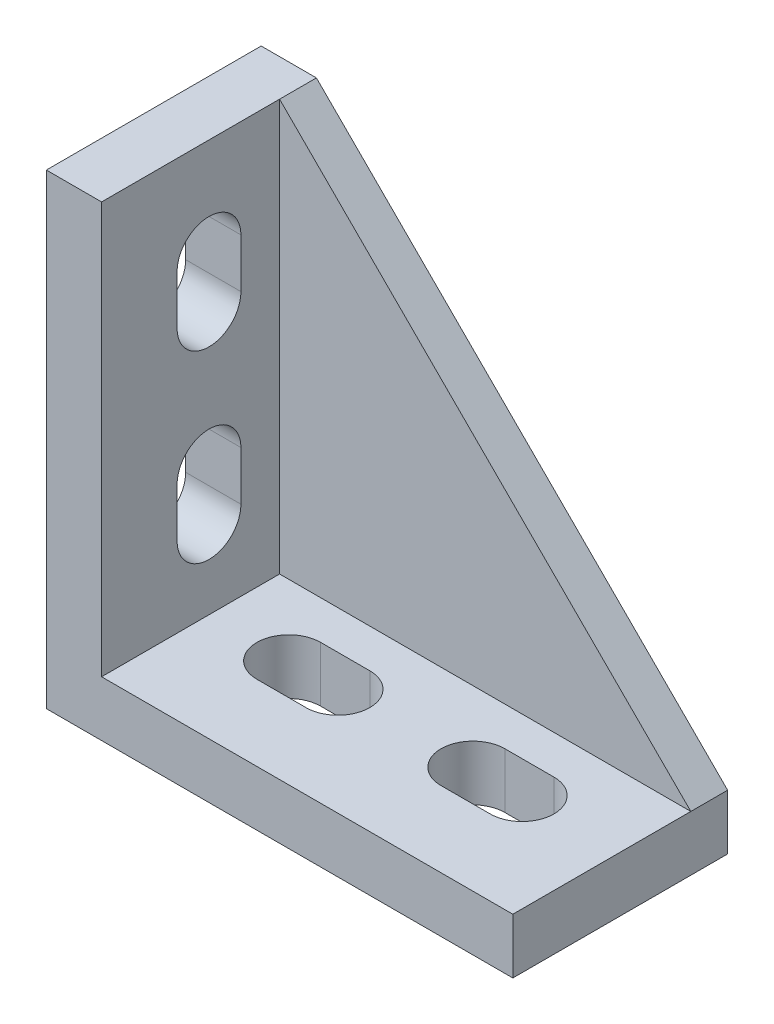
ISO-10303-21;
HEADER;
FILE_DESCRIPTION(('STEP AP214'),'2;1');
FILE_NAME('part.step','',(''),(''),'','','');
FILE_SCHEMA(('AUTOMOTIVE_DESIGN { 1 0 10303 214 1 1 1 1 }'));
ENDSEC;
DATA;
#1=APPLICATION_CONTEXT('core data for automotive mechanical design processes');
#2=APPLICATION_PROTOCOL_DEFINITION('international standard','automotive_design',2000,#1);
#3=PRODUCT_CONTEXT('',#1,'mechanical');
#4=PRODUCT('Part','Part','',(#3));
#5=PRODUCT_RELATED_PRODUCT_CATEGORY('part','',(#4));
#6=PRODUCT_DEFINITION_FORMATION('','',#4);
#7=PRODUCT_DEFINITION_CONTEXT('part definition',#1,'design');
#8=PRODUCT_DEFINITION('design','',#6,#7);
#9=PRODUCT_DEFINITION_SHAPE('','',#8);
#10=(LENGTH_UNIT() NAMED_UNIT(*) SI_UNIT(.MILLI.,.METRE.));
#11=(NAMED_UNIT(*) PLANE_ANGLE_UNIT() SI_UNIT($,.RADIAN.));
#12=(NAMED_UNIT(*) SI_UNIT($,.STERADIAN.) SOLID_ANGLE_UNIT());
#13=UNCERTAINTY_MEASURE_WITH_UNIT(LENGTH_MEASURE(1.E-05),#10,'distance_accuracy_value','');
#14=(GEOMETRIC_REPRESENTATION_CONTEXT(3) GLOBAL_UNCERTAINTY_ASSIGNED_CONTEXT((#13)) GLOBAL_UNIT_ASSIGNED_CONTEXT((#10,
#11,#12)) REPRESENTATION_CONTEXT('',''));
#15=CARTESIAN_POINT('',(0.,0.,0.));
#16=DIRECTION('',(0.,0.,1.));
#17=DIRECTION('',(1.,0.,0.));
#18=AXIS2_PLACEMENT_3D('',#15,#16,#17);
#19=CARTESIAN_POINT('',(4.5000000000001,4.5,8.75));
#20=DIRECTION('',(0.,1.,0.));
#21=DIRECTION('',(-1.,0.,0.));
#22=AXIS2_PLACEMENT_3D('',#19,#20,#21);
#23=PLANE('',#22);
#24=CARTESIAN_POINT('',(30.,4.49999999999991,0.));
#25=DIRECTION('',(0.,1.,0.));
#26=DIRECTION('',(-1.,0.,0.));
#27=AXIS2_PLACEMENT_3D('',#24,#25,#26);
#28=CIRCLE('',#27,2.6);
#29=CARTESIAN_POINT('',(30.,4.49999999999991,2.6));
#30=VERTEX_POINT('',#29);
#31=CARTESIAN_POINT('',(30.,4.49999999999991,-2.6));
#32=VERTEX_POINT('',#31);
#33=EDGE_CURVE('E272',#30,#32,#28,.T.);
#34=ORIENTED_EDGE('',*,*,#33,.F.);
#35=DIRECTION('',(1.,0.,0.));
#36=VECTOR('',#35,1.);
#37=CARTESIAN_POINT('',(30.,4.49999999999991,2.6));
#38=LINE('',#37,#36);
#39=CARTESIAN_POINT('',(26.,4.49999999999993,2.6));
#40=VERTEX_POINT('',#39);
#41=EDGE_CURVE('E262',#40,#30,#38,.T.);
#42=ORIENTED_EDGE('',*,*,#41,.F.);
#43=CARTESIAN_POINT('',(26.,4.49999999999993,0.));
#44=DIRECTION('',(0.,1.,0.));
#45=DIRECTION('',(-1.,0.,0.));
#46=AXIS2_PLACEMENT_3D('',#43,#44,#45);
#47=CIRCLE('',#46,2.6);
#48=CARTESIAN_POINT('',(26.,4.49999999999993,-2.6));
#49=VERTEX_POINT('',#48);
#50=EDGE_CURVE('E278',#49,#40,#47,.T.);
#51=ORIENTED_EDGE('',*,*,#50,.F.);
#52=DIRECTION('',(-1.,0.,0.));
#53=VECTOR('',#52,1.);
#54=CARTESIAN_POINT('',(30.,4.49999999999991,-2.6));
#55=LINE('',#54,#53);
#56=EDGE_CURVE('E274',#32,#49,#55,.T.);
#57=ORIENTED_EDGE('',*,*,#56,.F.);
#58=EDGE_LOOP('',(#34,#42,#51,#57));
#59=FACE_BOUND('',#58,.T.);
#60=CARTESIAN_POINT('',(11.,4.49999999999998,0.));
#61=DIRECTION('',(0.,1.,0.));
#62=DIRECTION('',(-1.,0.,0.));
#63=AXIS2_PLACEMENT_3D('',#60,#61,#62);
#64=CIRCLE('',#63,2.6);
#65=CARTESIAN_POINT('',(11.,4.49999999999998,-2.6));
#66=VERTEX_POINT('',#65);
#67=CARTESIAN_POINT('',(11.,4.49999999999998,2.6));
#68=VERTEX_POINT('',#67);
#69=EDGE_CURVE('E225',#66,#68,#64,.T.);
#70=ORIENTED_EDGE('',*,*,#69,.F.);
#71=DIRECTION('',(-1.,0.,0.));
#72=VECTOR('',#71,1.);
#73=CARTESIAN_POINT('',(11.,4.49999999999998,-2.6));
#74=LINE('',#73,#72);
#75=CARTESIAN_POINT('',(15.,4.49999999999997,-2.6));
#76=VERTEX_POINT('',#75);
#77=EDGE_CURVE('E296',#76,#66,#74,.T.);
#78=ORIENTED_EDGE('',*,*,#77,.F.);
#79=CARTESIAN_POINT('',(15.,4.49999999999997,0.));
#80=DIRECTION('',(0.,1.,0.));
#81=DIRECTION('',(-1.,0.,0.));
#82=AXIS2_PLACEMENT_3D('',#79,#80,#81);
#83=CIRCLE('',#82,2.6);
#84=CARTESIAN_POINT('',(15.,4.49999999999997,2.6));
#85=VERTEX_POINT('',#84);
#86=EDGE_CURVE('E310',#85,#76,#83,.T.);
#87=ORIENTED_EDGE('',*,*,#86,.F.);
#88=DIRECTION('',(1.,0.,0.));
#89=VECTOR('',#88,1.);
#90=CARTESIAN_POINT('',(11.,4.49999999999998,2.6));
#91=LINE('',#90,#89);
#92=EDGE_CURVE('E307',#68,#85,#91,.T.);
#93=ORIENTED_EDGE('',*,*,#92,.F.);
#94=EDGE_LOOP('',(#70,#78,#87,#93));
#95=FACE_BOUND('',#94,.T.);
#96=DIRECTION('',(0.,0.,-1.));
#97=VECTOR('',#96,1.);
#98=CARTESIAN_POINT('',(38.,4.49999999999989,8.75));
#99=LINE('',#98,#97);
#100=CARTESIAN_POINT('',(38.,4.49999999999989,8.75));
#101=VERTEX_POINT('',#100);
#102=CARTESIAN_POINT('',(38.,4.49999999999989,-5.75));
#103=VERTEX_POINT('',#102);
#104=EDGE_CURVE('E371',#101,#103,#99,.T.);
#105=ORIENTED_EDGE('',*,*,#104,.T.);
#106=DIRECTION('',(-1.,0.,0.));
#107=VECTOR('',#106,1.);
#108=CARTESIAN_POINT('',(4.5000000000001,4.5,-5.75));
#109=LINE('',#108,#107);
#110=CARTESIAN_POINT('',(4.5000000000001,4.5,-5.75));
#111=VERTEX_POINT('',#110);
#112=EDGE_CURVE('E330',#103,#111,#109,.T.);
#113=ORIENTED_EDGE('',*,*,#112,.T.);
#114=DIRECTION('',(0.,0.,-1.));
#115=VECTOR('',#114,1.);
#116=CARTESIAN_POINT('',(4.5000000000001,4.5,8.75));
#117=LINE('',#116,#115);
#118=CARTESIAN_POINT('',(4.5000000000001,4.5,8.75));
#119=VERTEX_POINT('',#118);
#120=EDGE_CURVE('E374',#119,#111,#117,.T.);
#121=ORIENTED_EDGE('',*,*,#120,.F.);
#122=DIRECTION('',(1.,0.,0.));
#123=VECTOR('',#122,1.);
#124=CARTESIAN_POINT('',(4.5000000000001,4.5,8.75));
#125=LINE('',#124,#123);
#126=EDGE_CURVE('E343',#119,#101,#125,.T.);
#127=ORIENTED_EDGE('',*,*,#126,.T.);
#128=EDGE_LOOP('',(#105,#113,#121,#127));
#129=FACE_BOUND('',#128,.T.);
#130=ADVANCED_FACE('F33',(#59,#95,#129),#23,.T.);
#131=CARTESIAN_POINT('',(4.5,38.,8.75));
#132=DIRECTION('',(1.,0.,0.));
#133=DIRECTION('',(0.,1.,0.));
#134=AXIS2_PLACEMENT_3D('',#131,#132,#133);
#135=PLANE('',#134);
#136=CARTESIAN_POINT('',(4.50000000000002,30.,0.));
#137=DIRECTION('',(1.,0.,0.));
#138=DIRECTION('',(0.,1.,0.));
#139=AXIS2_PLACEMENT_3D('',#136,#137,#138);
#140=CIRCLE('',#139,2.6);
#141=CARTESIAN_POINT('',(4.50000000000002,30.,-2.6));
#142=VERTEX_POINT('',#141);
#143=CARTESIAN_POINT('',(4.50000000000002,30.,2.6));
#144=VERTEX_POINT('',#143);
#145=EDGE_CURVE('E48',#142,#144,#140,.T.);
#146=ORIENTED_EDGE('',*,*,#145,.F.);
#147=DIRECTION('',(0.,1.,0.));
#148=VECTOR('',#147,1.);
#149=CARTESIAN_POINT('',(4.50000000000002,30.,-2.6));
#150=LINE('',#149,#148);
#151=CARTESIAN_POINT('',(4.50000000000004,26.,-2.6));
#152=VERTEX_POINT('',#151);
#153=EDGE_CURVE('E209',#152,#142,#150,.T.);
#154=ORIENTED_EDGE('',*,*,#153,.F.);
#155=CARTESIAN_POINT('',(4.50000000000004,26.,0.));
#156=DIRECTION('',(1.,0.,0.));
#157=DIRECTION('',(0.,1.,0.));
#158=AXIS2_PLACEMENT_3D('',#155,#156,#157);
#159=CIRCLE('',#158,2.6);
#160=CARTESIAN_POINT('',(4.50000000000004,26.,2.6));
#161=VERTEX_POINT('',#160);
#162=EDGE_CURVE('E212',#161,#152,#159,.T.);
#163=ORIENTED_EDGE('',*,*,#162,.F.);
#164=DIRECTION('',(0.,-1.,0.));
#165=VECTOR('',#164,1.);
#166=CARTESIAN_POINT('',(4.50000000000002,30.,2.6));
#167=LINE('',#166,#165);
#168=EDGE_CURVE('E218',#144,#161,#167,.T.);
#169=ORIENTED_EDGE('',*,*,#168,.F.);
#170=EDGE_LOOP('',(#146,#154,#163,#169));
#171=FACE_BOUND('',#170,.T.);
#172=CARTESIAN_POINT('',(4.50000000000007,15.,0.));
#173=DIRECTION('',(1.,0.,0.));
#174=DIRECTION('',(0.,1.,0.));
#175=AXIS2_PLACEMENT_3D('',#172,#173,#174);
#176=CIRCLE('',#175,2.6);
#177=CARTESIAN_POINT('',(4.50000000000007,15.,-2.6));
#178=VERTEX_POINT('',#177);
#179=CARTESIAN_POINT('',(4.50000000000007,15.,2.6));
#180=VERTEX_POINT('',#179);
#181=EDGE_CURVE('E56',#178,#180,#176,.T.);
#182=ORIENTED_EDGE('',*,*,#181,.F.);
#183=DIRECTION('',(0.,1.,0.));
#184=VECTOR('',#183,1.);
#185=CARTESIAN_POINT('',(4.50000000000007,15.,-2.6));
#186=LINE('',#185,#184);
#187=CARTESIAN_POINT('',(4.50000000000008,11.,-2.6));
#188=VERTEX_POINT('',#187);
#189=EDGE_CURVE('E233',#188,#178,#186,.T.);
#190=ORIENTED_EDGE('',*,*,#189,.F.);
#191=CARTESIAN_POINT('',(4.50000000000008,11.,0.));
#192=DIRECTION('',(1.,0.,0.));
#193=DIRECTION('',(0.,1.,0.));
#194=AXIS2_PLACEMENT_3D('',#191,#192,#193);
#195=CIRCLE('',#194,2.6);
#196=CARTESIAN_POINT('',(4.50000000000008,11.,2.6));
#197=VERTEX_POINT('',#196);
#198=EDGE_CURVE('E247',#197,#188,#195,.T.);
#199=ORIENTED_EDGE('',*,*,#198,.F.);
#200=DIRECTION('',(0.,-1.,0.));
#201=VECTOR('',#200,1.);
#202=CARTESIAN_POINT('',(4.50000000000007,15.,2.6));
#203=LINE('',#202,#201);
#204=EDGE_CURVE('E244',#180,#197,#203,.T.);
#205=ORIENTED_EDGE('',*,*,#204,.F.);
#206=EDGE_LOOP('',(#182,#190,#199,#205));
#207=FACE_BOUND('',#206,.T.);
#208=ORIENTED_EDGE('',*,*,#120,.T.);
#209=DIRECTION('',(0.,1.,0.));
#210=VECTOR('',#209,1.);
#211=CARTESIAN_POINT('',(4.5,38.,-5.75));
#212=LINE('',#211,#210);
#213=CARTESIAN_POINT('',(4.5,38.,-5.75));
#214=VERTEX_POINT('',#213);
#215=EDGE_CURVE('E11',#111,#214,#212,.T.);
#216=ORIENTED_EDGE('',*,*,#215,.T.);
#217=DIRECTION('',(0.,0.,-1.));
#218=VECTOR('',#217,1.);
#219=CARTESIAN_POINT('',(4.5,38.,8.75));
#220=LINE('',#219,#218);
#221=CARTESIAN_POINT('',(4.5,38.,8.75));
#222=VERTEX_POINT('',#221);
#223=EDGE_CURVE('E355',#222,#214,#220,.T.);
#224=ORIENTED_EDGE('',*,*,#223,.F.);
#225=DIRECTION('',(0.,-1.,0.));
#226=VECTOR('',#225,1.);
#227=CARTESIAN_POINT('',(4.5,38.,8.75));
#228=LINE('',#227,#226);
#229=EDGE_CURVE('E339',#222,#119,#228,.T.);
#230=ORIENTED_EDGE('',*,*,#229,.T.);
#231=EDGE_LOOP('',(#208,#216,#224,#230));
#232=FACE_BOUND('',#231,.T.);
#233=ADVANCED_FACE('F382',(#171,#207,#232),#135,.T.);
#234=CARTESIAN_POINT('',(0.,38.,8.75));
#235=DIRECTION('',(0.,1.,0.));
#236=DIRECTION('',(0.,0.,1.));
#237=AXIS2_PLACEMENT_3D('',#234,#235,#236);
#238=PLANE('',#237);
#239=DIRECTION('',(1.,0.,0.));
#240=VECTOR('',#239,1.);
#241=CARTESIAN_POINT('',(0.,38.,-8.75));
#242=LINE('',#241,#240);
#243=CARTESIAN_POINT('',(0.,38.,-8.75));
#244=VERTEX_POINT('',#243);
#245=CARTESIAN_POINT('',(4.5,38.,-8.75));
#246=VERTEX_POINT('',#245);
#247=EDGE_CURVE('E335',#244,#246,#242,.T.);
#248=ORIENTED_EDGE('',*,*,#247,.F.);
#249=DIRECTION('',(0.,0.,-1.));
#250=VECTOR('',#249,1.);
#251=CARTESIAN_POINT('',(0.,38.,8.75));
#252=LINE('',#251,#250);
#253=CARTESIAN_POINT('',(0.,38.,8.75));
#254=VERTEX_POINT('',#253);
#255=EDGE_CURVE('E41',#254,#244,#252,.T.);
#256=ORIENTED_EDGE('',*,*,#255,.F.);
#257=DIRECTION('',(1.,0.,0.));
#258=VECTOR('',#257,1.);
#259=CARTESIAN_POINT('',(0.,38.,8.75));
#260=LINE('',#259,#258);
#261=EDGE_CURVE('E336',#254,#222,#260,.T.);
#262=ORIENTED_EDGE('',*,*,#261,.T.);
#263=ORIENTED_EDGE('',*,*,#223,.T.);
#264=DIRECTION('',(0.,0.,-1.));
#265=VECTOR('',#264,1.);
#266=CARTESIAN_POINT('',(4.5,38.,-5.75));
#267=LINE('',#266,#265);
#268=EDGE_CURVE('E325',#214,#246,#267,.T.);
#269=ORIENTED_EDGE('',*,*,#268,.T.);
#270=EDGE_LOOP('',(#248,#256,#262,#263,#269));
#271=FACE_BOUND('',#270,.T.);
#272=ADVANCED_FACE('F35',(#271),#238,.T.);
#273=CARTESIAN_POINT('',(0.,0.,8.75));
#274=DIRECTION('',(-1.,0.,0.));
#275=DIRECTION('',(0.,0.,1.));
#276=AXIS2_PLACEMENT_3D('',#273,#274,#275);
#277=PLANE('',#276);
#278=CARTESIAN_POINT('',(0.,30.,0.));
#279=DIRECTION('',(1.,0.,0.));
#280=DIRECTION('',(0.,1.,0.));
#281=AXIS2_PLACEMENT_3D('',#278,#279,#280);
#282=CIRCLE('',#281,2.6);
#283=CARTESIAN_POINT('',(0.,30.,-2.6));
#284=VERTEX_POINT('',#283);
#285=CARTESIAN_POINT('',(0.,30.,2.6));
#286=VERTEX_POINT('',#285);
#287=EDGE_CURVE('E190',#284,#286,#282,.T.);
#288=ORIENTED_EDGE('',*,*,#287,.T.);
#289=DIRECTION('',(0.,-1.,0.));
#290=VECTOR('',#289,1.);
#291=CARTESIAN_POINT('',(0.,30.,2.6));
#292=LINE('',#291,#290);
#293=CARTESIAN_POINT('',(0.,26.,2.6));
#294=VERTEX_POINT('',#293);
#295=EDGE_CURVE('E200',#286,#294,#292,.T.);
#296=ORIENTED_EDGE('',*,*,#295,.T.);
#297=CARTESIAN_POINT('',(0.,26.,0.));
#298=DIRECTION('',(1.,0.,0.));
#299=DIRECTION('',(0.,1.,0.));
#300=AXIS2_PLACEMENT_3D('',#297,#298,#299);
#301=CIRCLE('',#300,2.6);
#302=CARTESIAN_POINT('',(0.,26.,-2.6));
#303=VERTEX_POINT('',#302);
#304=EDGE_CURVE('E204',#294,#303,#301,.T.);
#305=ORIENTED_EDGE('',*,*,#304,.T.);
#306=DIRECTION('',(0.,1.,0.));
#307=VECTOR('',#306,1.);
#308=CARTESIAN_POINT('',(0.,30.,-2.6));
#309=LINE('',#308,#307);
#310=EDGE_CURVE('E196',#303,#284,#309,.T.);
#311=ORIENTED_EDGE('',*,*,#310,.T.);
#312=EDGE_LOOP('',(#288,#296,#305,#311));
#313=FACE_BOUND('',#312,.T.);
#314=CARTESIAN_POINT('',(0.,15.,0.));
#315=DIRECTION('',(1.,0.,0.));
#316=DIRECTION('',(0.,1.,0.));
#317=AXIS2_PLACEMENT_3D('',#314,#315,#316);
#318=CIRCLE('',#317,2.6);
#319=CARTESIAN_POINT('',(0.,15.,-2.6));
#320=VERTEX_POINT('',#319);
#321=CARTESIAN_POINT('',(0.,15.,2.6));
#322=VERTEX_POINT('',#321);
#323=EDGE_CURVE('E229',#320,#322,#318,.T.);
#324=ORIENTED_EDGE('',*,*,#323,.T.);
#325=DIRECTION('',(0.,-1.,0.));
#326=VECTOR('',#325,1.);
#327=CARTESIAN_POINT('',(0.,15.,2.6));
#328=LINE('',#327,#326);
#329=CARTESIAN_POINT('',(0.,11.,2.6));
#330=VERTEX_POINT('',#329);
#331=EDGE_CURVE('E232',#322,#330,#328,.T.);
#332=ORIENTED_EDGE('',*,*,#331,.T.);
#333=CARTESIAN_POINT('',(0.,11.,0.));
#334=DIRECTION('',(1.,0.,0.));
#335=DIRECTION('',(0.,1.,0.));
#336=AXIS2_PLACEMENT_3D('',#333,#334,#335);
#337=CIRCLE('',#336,2.6);
#338=CARTESIAN_POINT('',(0.,11.,-2.6));
#339=VERTEX_POINT('',#338);
#340=EDGE_CURVE('E236',#330,#339,#337,.T.);
#341=ORIENTED_EDGE('',*,*,#340,.T.);
#342=DIRECTION('',(0.,1.,0.));
#343=VECTOR('',#342,1.);
#344=CARTESIAN_POINT('',(0.,15.,-2.6));
#345=LINE('',#344,#343);
#346=EDGE_CURVE('E239',#339,#320,#345,.T.);
#347=ORIENTED_EDGE('',*,*,#346,.T.);
#348=EDGE_LOOP('',(#324,#332,#341,#347));
#349=FACE_BOUND('',#348,.T.);
#350=DIRECTION('',(0.,1.,0.));
#351=VECTOR('',#350,1.);
#352=CARTESIAN_POINT('',(0.,0.,-8.75));
#353=LINE('',#352,#351);
#354=CARTESIAN_POINT('',(0.,0.,-8.75));
#355=VERTEX_POINT('',#354);
#356=EDGE_CURVE('E340',#355,#244,#353,.T.);
#357=ORIENTED_EDGE('',*,*,#356,.F.);
#358=DIRECTION('',(0.,0.,-1.));
#359=VECTOR('',#358,1.);
#360=CARTESIAN_POINT('',(0.,0.,8.75));
#361=LINE('',#360,#359);
#362=CARTESIAN_POINT('',(0.,0.,8.75));
#363=VERTEX_POINT('',#362);
#364=EDGE_CURVE('E367',#363,#355,#361,.T.);
#365=ORIENTED_EDGE('',*,*,#364,.F.);
#366=DIRECTION('',(0.,1.,0.));
#367=VECTOR('',#366,1.);
#368=CARTESIAN_POINT('',(0.,0.,8.75));
#369=LINE('',#368,#367);
#370=EDGE_CURVE('E352',#363,#254,#369,.T.);
#371=ORIENTED_EDGE('',*,*,#370,.T.);
#372=ORIENTED_EDGE('',*,*,#255,.T.);
#373=EDGE_LOOP('',(#357,#365,#371,#372));
#374=FACE_BOUND('',#373,.T.);
#375=ADVANCED_FACE('F206',(#313,#349,#374),#277,.T.);
#376=CARTESIAN_POINT('',(38.,-1.13549251216943E-13,8.75));
#377=DIRECTION('',(0.,-1.,0.));
#378=DIRECTION('',(1.,0.,0.));
#379=AXIS2_PLACEMENT_3D('',#376,#377,#378);
#380=PLANE('',#379);
#381=CARTESIAN_POINT('',(30.,0.,0.));
#382=DIRECTION('',(0.,1.,0.));
#383=DIRECTION('',(-1.,0.,0.));
#384=AXIS2_PLACEMENT_3D('',#381,#382,#383);
#385=CIRCLE('',#384,2.6);
#386=CARTESIAN_POINT('',(30.,0.,2.6));
#387=VERTEX_POINT('',#386);
#388=CARTESIAN_POINT('',(30.,0.,-2.6));
#389=VERTEX_POINT('',#388);
#390=EDGE_CURVE('E258',#387,#389,#385,.T.);
#391=ORIENTED_EDGE('',*,*,#390,.T.);
#392=DIRECTION('',(-1.,0.,0.));
#393=VECTOR('',#392,1.);
#394=CARTESIAN_POINT('',(30.,0.,-2.6));
#395=LINE('',#394,#393);
#396=CARTESIAN_POINT('',(26.,0.,-2.6));
#397=VERTEX_POINT('',#396);
#398=EDGE_CURVE('E261',#389,#397,#395,.T.);
#399=ORIENTED_EDGE('',*,*,#398,.T.);
#400=CARTESIAN_POINT('',(26.,0.,0.));
#401=DIRECTION('',(0.,1.,0.));
#402=DIRECTION('',(-1.,0.,0.));
#403=AXIS2_PLACEMENT_3D('',#400,#401,#402);
#404=CIRCLE('',#403,2.6);
#405=CARTESIAN_POINT('',(26.,0.,2.6));
#406=VERTEX_POINT('',#405);
#407=EDGE_CURVE('E265',#397,#406,#404,.T.);
#408=ORIENTED_EDGE('',*,*,#407,.T.);
#409=DIRECTION('',(1.,0.,0.));
#410=VECTOR('',#409,1.);
#411=CARTESIAN_POINT('',(30.,0.,2.6));
#412=LINE('',#411,#410);
#413=EDGE_CURVE('E268',#406,#387,#412,.T.);
#414=ORIENTED_EDGE('',*,*,#413,.T.);
#415=EDGE_LOOP('',(#391,#399,#408,#414));
#416=FACE_BOUND('',#415,.T.);
#417=CARTESIAN_POINT('',(11.,0.,0.));
#418=DIRECTION('',(0.,1.,0.));
#419=DIRECTION('',(-1.,0.,0.));
#420=AXIS2_PLACEMENT_3D('',#417,#418,#419);
#421=CIRCLE('',#420,2.6);
#422=CARTESIAN_POINT('',(11.,0.,-2.6));
#423=VERTEX_POINT('',#422);
#424=CARTESIAN_POINT('',(11.,0.,2.6));
#425=VERTEX_POINT('',#424);
#426=EDGE_CURVE('E292',#423,#425,#421,.T.);
#427=ORIENTED_EDGE('',*,*,#426,.T.);
#428=DIRECTION('',(1.,0.,0.));
#429=VECTOR('',#428,1.);
#430=CARTESIAN_POINT('',(11.,0.,2.6));
#431=LINE('',#430,#429);
#432=CARTESIAN_POINT('',(15.,0.,2.6));
#433=VERTEX_POINT('',#432);
#434=EDGE_CURVE('E295',#425,#433,#431,.T.);
#435=ORIENTED_EDGE('',*,*,#434,.T.);
#436=CARTESIAN_POINT('',(15.,0.,0.));
#437=DIRECTION('',(0.,1.,0.));
#438=DIRECTION('',(-1.,0.,0.));
#439=AXIS2_PLACEMENT_3D('',#436,#437,#438);
#440=CIRCLE('',#439,2.6);
#441=CARTESIAN_POINT('',(15.,0.,-2.6));
#442=VERTEX_POINT('',#441);
#443=EDGE_CURVE('E299',#433,#442,#440,.T.);
#444=ORIENTED_EDGE('',*,*,#443,.T.);
#445=DIRECTION('',(-1.,0.,0.));
#446=VECTOR('',#445,1.);
#447=CARTESIAN_POINT('',(11.,0.,-2.6));
#448=LINE('',#447,#446);
#449=EDGE_CURVE('E302',#442,#423,#448,.T.);
#450=ORIENTED_EDGE('',*,*,#449,.T.);
#451=EDGE_LOOP('',(#427,#435,#444,#450));
#452=FACE_BOUND('',#451,.T.);
#453=DIRECTION('',(-1.,0.,0.));
#454=VECTOR('',#453,1.);
#455=CARTESIAN_POINT('',(38.,-1.13549251216943E-13,-8.75));
#456=LINE('',#455,#454);
#457=CARTESIAN_POINT('',(38.,-1.13549251216943E-13,-8.75));
#458=VERTEX_POINT('',#457);
#459=EDGE_CURVE('E361',#458,#355,#456,.T.);
#460=ORIENTED_EDGE('',*,*,#459,.F.);
#461=DIRECTION('',(0.,0.,-1.));
#462=VECTOR('',#461,1.);
#463=CARTESIAN_POINT('',(38.,-1.13549251216943E-13,8.75));
#464=LINE('',#463,#462);
#465=CARTESIAN_POINT('',(38.,-1.13549251216943E-13,8.75));
#466=VERTEX_POINT('',#465);
#467=EDGE_CURVE('E369',#466,#458,#464,.T.);
#468=ORIENTED_EDGE('',*,*,#467,.F.);
#469=DIRECTION('',(-1.,0.,0.));
#470=VECTOR('',#469,1.);
#471=CARTESIAN_POINT('',(38.,-1.13549251216943E-13,8.75));
#472=LINE('',#471,#470);
#473=EDGE_CURVE('E349',#466,#363,#472,.T.);
#474=ORIENTED_EDGE('',*,*,#473,.T.);
#475=ORIENTED_EDGE('',*,*,#364,.T.);
#476=EDGE_LOOP('',(#460,#468,#474,#475));
#477=FACE_BOUND('',#476,.T.);
#478=ADVANCED_FACE('F405',(#416,#452,#477),#380,.T.);
#479=CARTESIAN_POINT('',(38.,4.49999999999989,8.75));
#480=DIRECTION('',(1.,0.,0.));
#481=DIRECTION('',(0.,0.,-1.));
#482=AXIS2_PLACEMENT_3D('',#479,#480,#481);
#483=PLANE('',#482);
#484=DIRECTION('',(0.,0.,-1.));
#485=VECTOR('',#484,1.);
#486=CARTESIAN_POINT('',(38.,4.49999999999989,-5.75));
#487=LINE('',#486,#485);
#488=CARTESIAN_POINT('',(38.,4.49999999999989,-8.75));
#489=VERTEX_POINT('',#488);
#490=EDGE_CURVE('E328',#103,#489,#487,.T.);
#491=ORIENTED_EDGE('',*,*,#490,.F.);
#492=ORIENTED_EDGE('',*,*,#104,.F.);
#493=DIRECTION('',(0.,-1.,0.));
#494=VECTOR('',#493,1.);
#495=CARTESIAN_POINT('',(38.,4.49999999999989,8.75));
#496=LINE('',#495,#494);
#497=EDGE_CURVE('E346',#101,#466,#496,.T.);
#498=ORIENTED_EDGE('',*,*,#497,.T.);
#499=ORIENTED_EDGE('',*,*,#467,.T.);
#500=DIRECTION('',(0.,-1.,0.));
#501=VECTOR('',#500,1.);
#502=CARTESIAN_POINT('',(38.,4.49999999999989,-8.75));
#503=LINE('',#502,#501);
#504=EDGE_CURVE('E358',#489,#458,#503,.T.);
#505=ORIENTED_EDGE('',*,*,#504,.F.);
#506=EDGE_LOOP('',(#491,#492,#498,#499,#505));
#507=FACE_BOUND('',#506,.T.);
#508=ADVANCED_FACE('F398',(#507),#483,.T.);
#509=CARTESIAN_POINT('',(0.,0.,8.75));
#510=DIRECTION('',(0.,0.,-1.));
#511=DIRECTION('',(-1.,0.,0.));
#512=AXIS2_PLACEMENT_3D('',#509,#510,#511);
#513=PLANE('',#512);
#514=ORIENTED_EDGE('',*,*,#261,.F.);
#515=ORIENTED_EDGE('',*,*,#370,.F.);
#516=ORIENTED_EDGE('',*,*,#473,.F.);
#517=ORIENTED_EDGE('',*,*,#497,.F.);
#518=ORIENTED_EDGE('',*,*,#126,.F.);
#519=ORIENTED_EDGE('',*,*,#229,.F.);
#520=EDGE_LOOP('',(#514,#515,#516,#517,#518,#519));
#521=FACE_BOUND('',#520,.T.);
#522=ADVANCED_FACE('F385',(#521),#513,.F.);
#523=CARTESIAN_POINT('',(0.,0.,-8.75));
#524=DIRECTION('',(0.,0.,-1.));
#525=DIRECTION('',(-1.,0.,0.));
#526=AXIS2_PLACEMENT_3D('',#523,#524,#525);
#527=PLANE('',#526);
#528=DIRECTION('',(0.707106781186546,-0.707106781186549,0.));
#529=VECTOR('',#528,1.);
#530=CARTESIAN_POINT('',(4.5,38.,-8.75));
#531=LINE('',#530,#529);
#532=EDGE_CURVE('E285',#246,#489,#531,.T.);
#533=ORIENTED_EDGE('',*,*,#532,.T.);
#534=ORIENTED_EDGE('',*,*,#504,.T.);
#535=ORIENTED_EDGE('',*,*,#459,.T.);
#536=ORIENTED_EDGE('',*,*,#356,.T.);
#537=ORIENTED_EDGE('',*,*,#247,.T.);
#538=EDGE_LOOP('',(#533,#534,#535,#536,#537));
#539=FACE_BOUND('',#538,.T.);
#540=ADVANCED_FACE('F401',(#539),#527,.T.);
#541=CARTESIAN_POINT('',(4.5,38.,-5.75));
#542=DIRECTION('',(0.707106781186549,0.707106781186546,0.));
#543=DIRECTION('',(-0.707106781186546,0.707106781186549,0.));
#544=AXIS2_PLACEMENT_3D('',#541,#542,#543);
#545=PLANE('',#544);
#546=ORIENTED_EDGE('',*,*,#532,.F.);
#547=ORIENTED_EDGE('',*,*,#268,.F.);
#548=DIRECTION('',(0.707106781186546,-0.707106781186549,0.));
#549=VECTOR('',#548,1.);
#550=CARTESIAN_POINT('',(4.5,38.,-5.75));
#551=LINE('',#550,#549);
#552=EDGE_CURVE('E322',#214,#103,#551,.T.);
#553=ORIENTED_EDGE('',*,*,#552,.T.);
#554=ORIENTED_EDGE('',*,*,#490,.T.);
#555=EDGE_LOOP('',(#546,#547,#553,#554));
#556=FACE_BOUND('',#555,.T.);
#557=ADVANCED_FACE('F395',(#556),#545,.T.);
#558=CARTESIAN_POINT('',(0.,0.,-5.75));
#559=DIRECTION('',(0.,0.,-1.));
#560=DIRECTION('',(-1.,0.,0.));
#561=AXIS2_PLACEMENT_3D('',#558,#559,#560);
#562=PLANE('',#561);
#563=ORIENTED_EDGE('',*,*,#112,.F.);
#564=ORIENTED_EDGE('',*,*,#552,.F.);
#565=ORIENTED_EDGE('',*,*,#215,.F.);
#566=EDGE_LOOP('',(#563,#564,#565));
#567=FACE_BOUND('',#566,.T.);
#568=ADVANCED_FACE('F392',(#567),#562,.F.);
#569=CARTESIAN_POINT('',(11.,0.,0.));
#570=DIRECTION('',(0.,1.,0.));
#571=DIRECTION('',(-1.,0.,0.));
#572=AXIS2_PLACEMENT_3D('',#569,#570,#571);
#573=CYLINDRICAL_SURFACE('',#572,2.6);
#574=ORIENTED_EDGE('',*,*,#69,.T.);
#575=DIRECTION('',(0.,1.,0.));
#576=VECTOR('',#575,1.);
#577=CARTESIAN_POINT('',(11.,0.,2.6));
#578=LINE('',#577,#576);
#579=EDGE_CURVE('E305',#425,#68,#578,.T.);
#580=ORIENTED_EDGE('',*,*,#579,.F.);
#581=ORIENTED_EDGE('',*,*,#426,.F.);
#582=DIRECTION('',(0.,1.,0.));
#583=VECTOR('',#582,1.);
#584=CARTESIAN_POINT('',(11.,0.,-2.6));
#585=LINE('',#584,#583);
#586=EDGE_CURVE('E275',#423,#66,#585,.T.);
#587=ORIENTED_EDGE('',*,*,#586,.T.);
#588=EDGE_LOOP('',(#574,#580,#581,#587));
#589=FACE_BOUND('',#588,.T.);
#590=ADVANCED_FACE('F434',(#589),#573,.F.);
#591=CARTESIAN_POINT('',(11.,0.,-2.6));
#592=DIRECTION('',(0.,0.,-1.));
#593=DIRECTION('',(-1.,0.,0.));
#594=AXIS2_PLACEMENT_3D('',#591,#592,#593);
#595=PLANE('',#594);
#596=ORIENTED_EDGE('',*,*,#77,.T.);
#597=ORIENTED_EDGE('',*,*,#586,.F.);
#598=ORIENTED_EDGE('',*,*,#449,.F.);
#599=DIRECTION('',(0.,1.,0.));
#600=VECTOR('',#599,1.);
#601=CARTESIAN_POINT('',(15.,0.,-2.6));
#602=LINE('',#601,#600);
#603=EDGE_CURVE('E316',#442,#76,#602,.T.);
#604=ORIENTED_EDGE('',*,*,#603,.T.);
#605=EDGE_LOOP('',(#596,#597,#598,#604));
#606=FACE_BOUND('',#605,.T.);
#607=ADVANCED_FACE('F442',(#606),#595,.F.);
#608=CARTESIAN_POINT('',(15.,0.,0.));
#609=DIRECTION('',(0.,1.,0.));
#610=DIRECTION('',(-1.,0.,0.));
#611=AXIS2_PLACEMENT_3D('',#608,#609,#610);
#612=CYLINDRICAL_SURFACE('',#611,2.6);
#613=ORIENTED_EDGE('',*,*,#86,.T.);
#614=ORIENTED_EDGE('',*,*,#603,.F.);
#615=ORIENTED_EDGE('',*,*,#443,.F.);
#616=DIRECTION('',(0.,1.,0.));
#617=VECTOR('',#616,1.);
#618=CARTESIAN_POINT('',(15.,0.,2.6));
#619=LINE('',#618,#617);
#620=EDGE_CURVE('E318',#433,#85,#619,.T.);
#621=ORIENTED_EDGE('',*,*,#620,.T.);
#622=EDGE_LOOP('',(#613,#614,#615,#621));
#623=FACE_BOUND('',#622,.T.);
#624=ADVANCED_FACE('F444',(#623),#612,.F.);
#625=CARTESIAN_POINT('',(11.,0.,2.6));
#626=DIRECTION('',(0.,0.,1.));
#627=DIRECTION('',(1.,0.,0.));
#628=AXIS2_PLACEMENT_3D('',#625,#626,#627);
#629=PLANE('',#628);
#630=ORIENTED_EDGE('',*,*,#92,.T.);
#631=ORIENTED_EDGE('',*,*,#620,.F.);
#632=ORIENTED_EDGE('',*,*,#434,.F.);
#633=ORIENTED_EDGE('',*,*,#579,.T.);
#634=EDGE_LOOP('',(#630,#631,#632,#633));
#635=FACE_BOUND('',#634,.T.);
#636=ADVANCED_FACE('F438',(#635),#629,.F.);
#637=CARTESIAN_POINT('',(30.,0.,0.));
#638=DIRECTION('',(0.,1.,0.));
#639=DIRECTION('',(-1.,0.,0.));
#640=AXIS2_PLACEMENT_3D('',#637,#638,#639);
#641=CYLINDRICAL_SURFACE('',#640,2.6);
#642=ORIENTED_EDGE('',*,*,#33,.T.);
#643=DIRECTION('',(0.,1.,0.));
#644=VECTOR('',#643,1.);
#645=CARTESIAN_POINT('',(30.,0.,-2.6));
#646=LINE('',#645,#644);
#647=EDGE_CURVE('E271',#389,#32,#646,.T.);
#648=ORIENTED_EDGE('',*,*,#647,.F.);
#649=ORIENTED_EDGE('',*,*,#390,.F.);
#650=DIRECTION('',(0.,1.,0.));
#651=VECTOR('',#650,1.);
#652=CARTESIAN_POINT('',(30.,0.,2.6));
#653=LINE('',#652,#651);
#654=EDGE_CURVE('E283',#387,#30,#653,.T.);
#655=ORIENTED_EDGE('',*,*,#654,.T.);
#656=EDGE_LOOP('',(#642,#648,#649,#655));
#657=FACE_BOUND('',#656,.T.);
#658=ADVANCED_FACE('F451',(#657),#641,.F.);
#659=CARTESIAN_POINT('',(30.,0.,2.6));
#660=DIRECTION('',(0.,0.,1.));
#661=DIRECTION('',(1.,0.,0.));
#662=AXIS2_PLACEMENT_3D('',#659,#660,#661);
#663=PLANE('',#662);
#664=ORIENTED_EDGE('',*,*,#41,.T.);
#665=ORIENTED_EDGE('',*,*,#654,.F.);
#666=ORIENTED_EDGE('',*,*,#413,.F.);
#667=DIRECTION('',(0.,1.,0.));
#668=VECTOR('',#667,1.);
#669=CARTESIAN_POINT('',(26.,0.,2.6));
#670=LINE('',#669,#668);
#671=EDGE_CURVE('E286',#406,#40,#670,.T.);
#672=ORIENTED_EDGE('',*,*,#671,.T.);
#673=EDGE_LOOP('',(#664,#665,#666,#672));
#674=FACE_BOUND('',#673,.T.);
#675=ADVANCED_FACE('F505',(#674),#663,.F.);
#676=CARTESIAN_POINT('',(26.,0.,0.));
#677=DIRECTION('',(0.,1.,0.));
#678=DIRECTION('',(-1.,0.,0.));
#679=AXIS2_PLACEMENT_3D('',#676,#677,#678);
#680=CYLINDRICAL_SURFACE('',#679,2.6);
#681=ORIENTED_EDGE('',*,*,#50,.T.);
#682=ORIENTED_EDGE('',*,*,#671,.F.);
#683=ORIENTED_EDGE('',*,*,#407,.F.);
#684=DIRECTION('',(0.,1.,0.));
#685=VECTOR('',#684,1.);
#686=CARTESIAN_POINT('',(26.,0.,-2.6));
#687=LINE('',#686,#685);
#688=EDGE_CURVE('E288',#397,#49,#687,.T.);
#689=ORIENTED_EDGE('',*,*,#688,.T.);
#690=EDGE_LOOP('',(#681,#682,#683,#689));
#691=FACE_BOUND('',#690,.T.);
#692=ADVANCED_FACE('F514',(#691),#680,.F.);
#693=CARTESIAN_POINT('',(30.,0.,-2.6));
#694=DIRECTION('',(0.,0.,-1.));
#695=DIRECTION('',(-1.,0.,0.));
#696=AXIS2_PLACEMENT_3D('',#693,#694,#695);
#697=PLANE('',#696);
#698=ORIENTED_EDGE('',*,*,#56,.T.);
#699=ORIENTED_EDGE('',*,*,#688,.F.);
#700=ORIENTED_EDGE('',*,*,#398,.F.);
#701=ORIENTED_EDGE('',*,*,#647,.T.);
#702=EDGE_LOOP('',(#698,#699,#700,#701));
#703=FACE_BOUND('',#702,.T.);
#704=ADVANCED_FACE('F524',(#703),#697,.F.);
#705=CARTESIAN_POINT('',(0.,15.,0.));
#706=DIRECTION('',(1.,0.,0.));
#707=DIRECTION('',(0.,1.,0.));
#708=AXIS2_PLACEMENT_3D('',#705,#706,#707);
#709=CYLINDRICAL_SURFACE('',#708,2.6);
#710=ORIENTED_EDGE('',*,*,#181,.T.);
#711=DIRECTION('',(1.,0.,0.));
#712=VECTOR('',#711,1.);
#713=CARTESIAN_POINT('',(0.,15.,2.6));
#714=LINE('',#713,#712);
#715=EDGE_CURVE('E242',#322,#180,#714,.T.);
#716=ORIENTED_EDGE('',*,*,#715,.F.);
#717=ORIENTED_EDGE('',*,*,#323,.F.);
#718=DIRECTION('',(1.,0.,0.));
#719=VECTOR('',#718,1.);
#720=CARTESIAN_POINT('',(0.,15.,-2.6));
#721=LINE('',#720,#719);
#722=EDGE_CURVE('E219',#320,#178,#721,.T.);
#723=ORIENTED_EDGE('',*,*,#722,.T.);
#724=EDGE_LOOP('',(#710,#716,#717,#723));
#725=FACE_BOUND('',#724,.T.);
#726=ADVANCED_FACE('F533',(#725),#709,.F.);
#727=CARTESIAN_POINT('',(0.,15.,-2.6));
#728=DIRECTION('',(0.,0.,-1.));
#729=DIRECTION('',(0.,1.,0.));
#730=AXIS2_PLACEMENT_3D('',#727,#728,#729);
#731=PLANE('',#730);
#732=ORIENTED_EDGE('',*,*,#189,.T.);
#733=ORIENTED_EDGE('',*,*,#722,.F.);
#734=ORIENTED_EDGE('',*,*,#346,.F.);
#735=DIRECTION('',(1.,0.,0.));
#736=VECTOR('',#735,1.);
#737=CARTESIAN_POINT('',(0.,11.,-2.6));
#738=LINE('',#737,#736);
#739=EDGE_CURVE('E253',#339,#188,#738,.T.);
#740=ORIENTED_EDGE('',*,*,#739,.T.);
#741=EDGE_LOOP('',(#732,#733,#734,#740));
#742=FACE_BOUND('',#741,.T.);
#743=ADVANCED_FACE('F551',(#742),#731,.F.);
#744=CARTESIAN_POINT('',(0.,11.,0.));
#745=DIRECTION('',(1.,0.,0.));
#746=DIRECTION('',(0.,1.,0.));
#747=AXIS2_PLACEMENT_3D('',#744,#745,#746);
#748=CYLINDRICAL_SURFACE('',#747,2.6);
#749=ORIENTED_EDGE('',*,*,#198,.T.);
#750=ORIENTED_EDGE('',*,*,#739,.F.);
#751=ORIENTED_EDGE('',*,*,#340,.F.);
#752=DIRECTION('',(1.,0.,0.));
#753=VECTOR('',#752,1.);
#754=CARTESIAN_POINT('',(0.,11.,2.6));
#755=LINE('',#754,#753);
#756=EDGE_CURVE('E255',#330,#197,#755,.T.);
#757=ORIENTED_EDGE('',*,*,#756,.T.);
#758=EDGE_LOOP('',(#749,#750,#751,#757));
#759=FACE_BOUND('',#758,.T.);
#760=ADVANCED_FACE('F560',(#759),#748,.F.);
#761=CARTESIAN_POINT('',(0.,15.,2.6));
#762=DIRECTION('',(0.,0.,1.));
#763=DIRECTION('',(0.,-1.,0.));
#764=AXIS2_PLACEMENT_3D('',#761,#762,#763);
#765=PLANE('',#764);
#766=ORIENTED_EDGE('',*,*,#204,.T.);
#767=ORIENTED_EDGE('',*,*,#756,.F.);
#768=ORIENTED_EDGE('',*,*,#331,.F.);
#769=ORIENTED_EDGE('',*,*,#715,.T.);
#770=EDGE_LOOP('',(#766,#767,#768,#769));
#771=FACE_BOUND('',#770,.T.);
#772=ADVANCED_FACE('F570',(#771),#765,.F.);
#773=CARTESIAN_POINT('',(0.,30.,0.));
#774=DIRECTION('',(1.,0.,0.));
#775=DIRECTION('',(0.,1.,0.));
#776=AXIS2_PLACEMENT_3D('',#773,#774,#775);
#777=CYLINDRICAL_SURFACE('',#776,2.6);
#778=ORIENTED_EDGE('',*,*,#145,.T.);
#779=DIRECTION('',(1.,0.,0.));
#780=VECTOR('',#779,1.);
#781=CARTESIAN_POINT('',(0.,30.,2.6));
#782=LINE('',#781,#780);
#783=EDGE_CURVE('E186',#286,#144,#782,.T.);
#784=ORIENTED_EDGE('',*,*,#783,.F.);
#785=ORIENTED_EDGE('',*,*,#287,.F.);
#786=DIRECTION('',(1.,0.,0.));
#787=VECTOR('',#786,1.);
#788=CARTESIAN_POINT('',(0.,30.,-2.6));
#789=LINE('',#788,#787);
#790=EDGE_CURVE('E223',#284,#142,#789,.T.);
#791=ORIENTED_EDGE('',*,*,#790,.T.);
#792=EDGE_LOOP('',(#778,#784,#785,#791));
#793=FACE_BOUND('',#792,.T.);
#794=ADVANCED_FACE('F188',(#793),#777,.F.);
#795=CARTESIAN_POINT('',(0.,30.,-2.6));
#796=DIRECTION('',(0.,0.,-1.));
#797=DIRECTION('',(0.,1.,0.));
#798=AXIS2_PLACEMENT_3D('',#795,#796,#797);
#799=PLANE('',#798);
#800=ORIENTED_EDGE('',*,*,#153,.T.);
#801=ORIENTED_EDGE('',*,*,#790,.F.);
#802=ORIENTED_EDGE('',*,*,#310,.F.);
#803=DIRECTION('',(1.,0.,0.));
#804=VECTOR('',#803,1.);
#805=CARTESIAN_POINT('',(0.,26.,-2.6));
#806=LINE('',#805,#804);
#807=EDGE_CURVE('E226',#303,#152,#806,.T.);
#808=ORIENTED_EDGE('',*,*,#807,.T.);
#809=EDGE_LOOP('',(#800,#801,#802,#808));
#810=FACE_BOUND('',#809,.T.);
#811=ADVANCED_FACE('F589',(#810),#799,.F.);
#812=CARTESIAN_POINT('',(0.,26.,0.));
#813=DIRECTION('',(1.,0.,0.));
#814=DIRECTION('',(0.,1.,0.));
#815=AXIS2_PLACEMENT_3D('',#812,#813,#814);
#816=CYLINDRICAL_SURFACE('',#815,2.6);
#817=ORIENTED_EDGE('',*,*,#162,.T.);
#818=ORIENTED_EDGE('',*,*,#807,.F.);
#819=ORIENTED_EDGE('',*,*,#304,.F.);
#820=DIRECTION('',(1.,0.,0.));
#821=VECTOR('',#820,1.);
#822=CARTESIAN_POINT('',(0.,26.,2.6));
#823=LINE('',#822,#821);
#824=EDGE_CURVE('E195',#294,#161,#823,.T.);
#825=ORIENTED_EDGE('',*,*,#824,.T.);
#826=EDGE_LOOP('',(#817,#818,#819,#825));
#827=FACE_BOUND('',#826,.T.);
#828=ADVANCED_FACE('F598',(#827),#816,.F.);
#829=CARTESIAN_POINT('',(0.,30.,2.6));
#830=DIRECTION('',(0.,0.,1.));
#831=DIRECTION('',(0.,-1.,0.));
#832=AXIS2_PLACEMENT_3D('',#829,#830,#831);
#833=PLANE('',#832);
#834=ORIENTED_EDGE('',*,*,#168,.T.);
#835=ORIENTED_EDGE('',*,*,#824,.F.);
#836=ORIENTED_EDGE('',*,*,#295,.F.);
#837=ORIENTED_EDGE('',*,*,#783,.T.);
#838=EDGE_LOOP('',(#834,#835,#836,#837));
#839=FACE_BOUND('',#838,.T.);
#840=ADVANCED_FACE('F201',(#839),#833,.F.);
#841=CLOSED_SHELL('',(#130,#233,#272,#375,#478,#508,#522,#540,#557,#568,#590,#607,#624,#636,
#658,#675,#692,#704,#726,#743,#760,#772,#794,#811,#828,#840));
#842=MANIFOLD_SOLID_BREP('B2',#841);
#843=ADVANCED_BREP_SHAPE_REPRESENTATION('',(#18,#842),#14);
#844=SHAPE_DEFINITION_REPRESENTATION(#9,#843);
ENDSEC;
END-ISO-10303-21;
